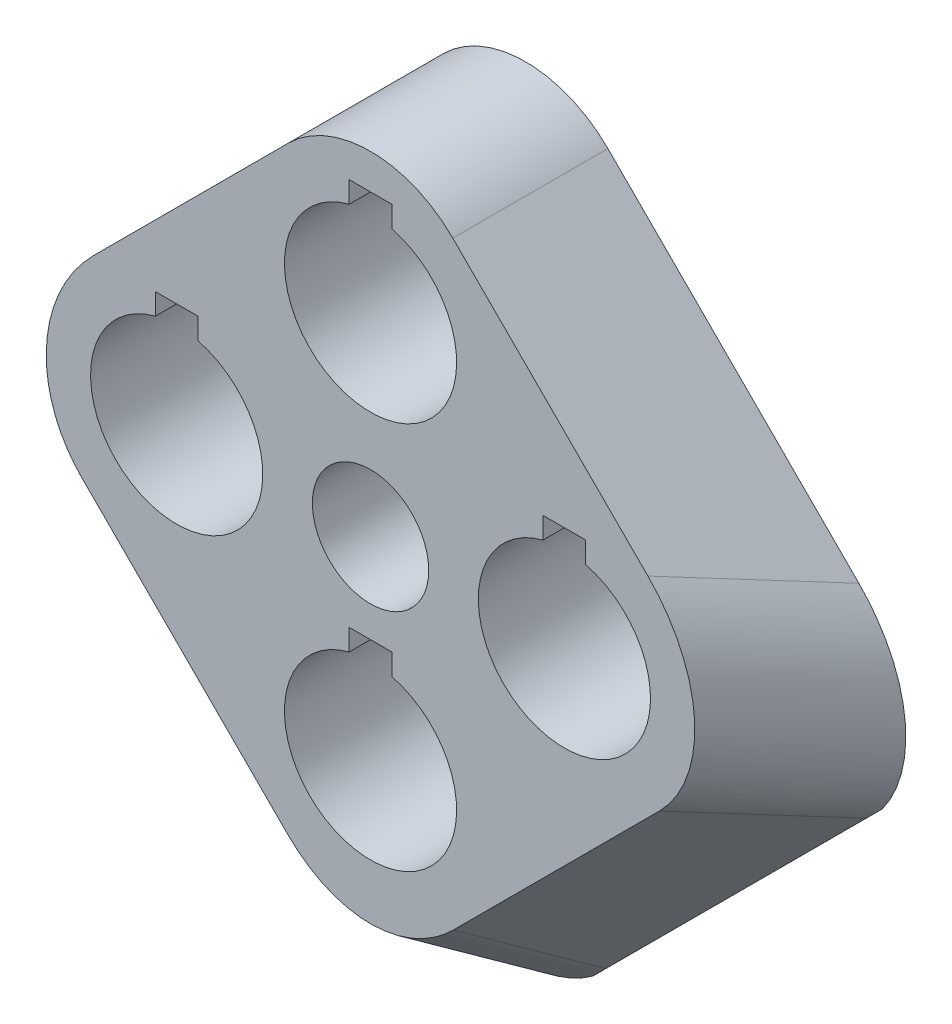
ISO-10303-21;
HEADER;
FILE_DESCRIPTION(('STEP AP214'),'2;1');
FILE_NAME('part.step','',(''),(''),'','','');
FILE_SCHEMA(('AUTOMOTIVE_DESIGN { 1 0 10303 214 1 1 1 1 }'));
ENDSEC;
DATA;
#1=APPLICATION_CONTEXT('core data for automotive mechanical design processes');
#2=APPLICATION_PROTOCOL_DEFINITION('international standard','automotive_design',2000,#1);
#3=PRODUCT_CONTEXT('',#1,'mechanical');
#4=PRODUCT('Part','Part','',(#3));
#5=PRODUCT_RELATED_PRODUCT_CATEGORY('part','',(#4));
#6=PRODUCT_DEFINITION_FORMATION('','',#4);
#7=PRODUCT_DEFINITION_CONTEXT('part definition',#1,'design');
#8=PRODUCT_DEFINITION('design','',#6,#7);
#9=PRODUCT_DEFINITION_SHAPE('','',#8);
#10=(LENGTH_UNIT() NAMED_UNIT(*) SI_UNIT(.MILLI.,.METRE.));
#11=(NAMED_UNIT(*) PLANE_ANGLE_UNIT() SI_UNIT($,.RADIAN.));
#12=(NAMED_UNIT(*) SI_UNIT($,.STERADIAN.) SOLID_ANGLE_UNIT());
#13=UNCERTAINTY_MEASURE_WITH_UNIT(LENGTH_MEASURE(1.E-05),#10,'distance_accuracy_value','');
#14=(GEOMETRIC_REPRESENTATION_CONTEXT(3) GLOBAL_UNCERTAINTY_ASSIGNED_CONTEXT((#13)) GLOBAL_UNIT_ASSIGNED_CONTEXT((#10,
#11,#12)) REPRESENTATION_CONTEXT('',''));
#15=CARTESIAN_POINT('',(0.,0.,0.));
#16=DIRECTION('',(0.,0.,1.));
#17=DIRECTION('',(1.,0.,0.));
#18=AXIS2_PLACEMENT_3D('',#15,#16,#17);
#19=CARTESIAN_POINT('',(0.,0.,20.));
#20=DIRECTION('',(0.,0.,1.));
#21=DIRECTION('',(1.,0.,0.));
#22=AXIS2_PLACEMENT_3D('',#19,#20,#21);
#23=PLANE('',#22);
#24=DIRECTION('',(0.707106781186547,-0.707106781186548,0.));
#25=VECTOR('',#24,1.);
#26=CARTESIAN_POINT('',(-12.1276695296628,-12.1276695296628,20.));
#27=LINE('',#26,#25);
#28=CARTESIAN_POINT('',(-37.2345237791552,12.9791847198296,20.));
#29=VERTEX_POINT('',#28);
#30=CARTESIAN_POINT('',(-10.7106248406957,-13.5447142186299,20.));
#31=VERTEX_POINT('',#30);
#32=EDGE_CURVE('E377',#29,#31,#27,.T.);
#33=ORIENTED_EDGE('',*,*,#32,.T.);
#34=CARTESIAN_POINT('',(1.84926216038584E-13,2.72721371405883,20.));
#35=DIRECTION('',(0.,0.,1.));
#36=DIRECTION('',(0.,1.,0.));
#37=AXIS2_PLACEMENT_3D('',#34,#35,#36);
#38=ELLIPSE('',#37,20.9537145673144,17.);
#39=CARTESIAN_POINT('',(10.7106248406959,-13.54471421863,20.));
#40=VERTEX_POINT('',#39);
#41=EDGE_CURVE('E392',#31,#40,#38,.T.);
#42=ORIENTED_EDGE('',*,*,#41,.T.);
#43=DIRECTION('',(0.707106781186554,0.707106781186541,0.));
#44=VECTOR('',#43,1.);
#45=CARTESIAN_POINT('',(12.1276695296629,-12.1276695296631,20.));
#46=LINE('',#45,#44);
#47=CARTESIAN_POINT('',(37.2345237791555,12.9791847198291,20.));
#48=VERTEX_POINT('',#47);
#49=EDGE_CURVE('E374',#40,#48,#46,.T.);
#50=ORIENTED_EDGE('',*,*,#49,.T.);
#51=CARTESIAN_POINT('',(23.7432473924633,26.4704611065215,20.));
#52=DIRECTION('',(0.,0.,1.));
#53=DIRECTION('',(0.707106781186548,-0.707106781186548,0.));
#54=AXIS2_PLACEMENT_3D('',#51,#52,#53);
#55=ELLIPSE('',#54,19.0795460397841,17.);
#56=CARTESIAN_POINT('',(35.7640626726346,38.4912763866928,20.));
#57=VERTEX_POINT('',#56);
#58=EDGE_CURVE('E390',#48,#57,#55,.T.);
#59=ORIENTED_EDGE('',*,*,#58,.T.);
#60=DIRECTION('',(-0.707106781186547,0.707106781186547,0.));
#61=VECTOR('',#60,1.);
#62=CARTESIAN_POINT('',(0.,74.2553390593274,20.));
#63=LINE('',#62,#61);
#64=CARTESIAN_POINT('',(10.6066017177982,63.6487373415292,20.));
#65=VERTEX_POINT('',#64);
#66=EDGE_CURVE('E352',#57,#65,#63,.T.);
#67=ORIENTED_EDGE('',*,*,#66,.T.);
#68=CARTESIAN_POINT('',(0.,53.0421356237309,20.));
#69=DIRECTION('',(0.,0.,1.));
#70=DIRECTION('',(1.,0.,0.));
#71=AXIS2_PLACEMENT_3D('',#68,#69,#70);
#72=CIRCLE('',#71,15.);
#73=CARTESIAN_POINT('',(-10.6066017177982,63.6487373415292,20.));
#74=VERTEX_POINT('',#73);
#75=EDGE_CURVE('E369',#65,#74,#72,.T.);
#76=ORIENTED_EDGE('',*,*,#75,.T.);
#77=DIRECTION('',(-0.707106781186548,-0.707106781186548,0.));
#78=VECTOR('',#77,1.);
#79=CARTESIAN_POINT('',(0.,74.2553390593274,20.));
#80=LINE('',#79,#78);
#81=CARTESIAN_POINT('',(-35.7640626726342,38.4912763866932,20.));
#82=VERTEX_POINT('',#81);
#83=EDGE_CURVE('E354',#74,#82,#80,.T.);
#84=ORIENTED_EDGE('',*,*,#83,.T.);
#85=CARTESIAN_POINT('',(-23.7432473924629,26.4704611065219,20.));
#86=DIRECTION('',(0.,0.,1.));
#87=DIRECTION('',(0.707106781186548,0.707106781186548,0.));
#88=AXIS2_PLACEMENT_3D('',#85,#86,#87);
#89=ELLIPSE('',#88,19.0795460397841,17.);
#90=EDGE_CURVE('E388',#82,#29,#89,.T.);
#91=ORIENTED_EDGE('',*,*,#90,.T.);
#92=EDGE_LOOP('',(#33,#42,#50,#59,#67,#76,#84,#91));
#93=FACE_BOUND('',#92,.T.);
#94=DIRECTION('',(0.,1.,0.));
#95=VECTOR('',#94,1.);
#96=CARTESIAN_POINT('',(27.75,38.5039527616593,20.));
#97=LINE('',#96,#95);
#98=CARTESIAN_POINT('',(27.75,35.7539527616593,20.));
#99=VERTEX_POINT('',#98);
#100=CARTESIAN_POINT('',(27.75,38.5039527616593,20.));
#101=VERTEX_POINT('',#100);
#102=EDGE_CURVE('E255',#99,#101,#97,.T.);
#103=ORIENTED_EDGE('',*,*,#102,.F.);
#104=CARTESIAN_POINT('',(25.,25.,20.));
#105=DIRECTION('',(0.,0.,1.));
#106=DIRECTION('',(1.,0.,0.));
#107=AXIS2_PLACEMENT_3D('',#104,#105,#106);
#108=CIRCLE('',#107,11.1);
#109=CARTESIAN_POINT('',(22.25,35.7539527616593,20.));
#110=VERTEX_POINT('',#109);
#111=EDGE_CURVE('E253',#110,#99,#108,.T.);
#112=ORIENTED_EDGE('',*,*,#111,.F.);
#113=DIRECTION('',(0.,-1.,0.));
#114=VECTOR('',#113,1.);
#115=CARTESIAN_POINT('',(22.25,38.5039527616593,20.));
#116=LINE('',#115,#114);
#117=CARTESIAN_POINT('',(22.25,38.5039527616593,20.));
#118=VERTEX_POINT('',#117);
#119=EDGE_CURVE('E261',#118,#110,#116,.T.);
#120=ORIENTED_EDGE('',*,*,#119,.F.);
#121=DIRECTION('',(-1.,0.,0.));
#122=VECTOR('',#121,1.);
#123=CARTESIAN_POINT('',(22.25,38.5039527616593,20.));
#124=LINE('',#123,#122);
#125=EDGE_CURVE('E258',#101,#118,#124,.T.);
#126=ORIENTED_EDGE('',*,*,#125,.F.);
#127=EDGE_LOOP('',(#103,#112,#120,#126));
#128=FACE_BOUND('',#127,.T.);
#129=DIRECTION('',(0.,1.,0.));
#130=VECTOR('',#129,1.);
#131=CARTESIAN_POINT('',(2.75,63.5039527616593,20.));
#132=LINE('',#131,#130);
#133=CARTESIAN_POINT('',(2.75,60.7539527616593,20.));
#134=VERTEX_POINT('',#133);
#135=CARTESIAN_POINT('',(2.75,63.5039527616593,20.));
#136=VERTEX_POINT('',#135);
#137=EDGE_CURVE('E292',#134,#136,#132,.T.);
#138=ORIENTED_EDGE('',*,*,#137,.F.);
#139=CARTESIAN_POINT('',(0.,50.,20.));
#140=DIRECTION('',(0.,0.,1.));
#141=DIRECTION('',(1.,0.,0.));
#142=AXIS2_PLACEMENT_3D('',#139,#140,#141);
#143=CIRCLE('',#142,11.1);
#144=CARTESIAN_POINT('',(-2.75,60.7539527616593,20.));
#145=VERTEX_POINT('',#144);
#146=EDGE_CURVE('E290',#145,#134,#143,.T.);
#147=ORIENTED_EDGE('',*,*,#146,.F.);
#148=DIRECTION('',(0.,-1.,0.));
#149=VECTOR('',#148,1.);
#150=CARTESIAN_POINT('',(-2.75,63.5039527616593,20.));
#151=LINE('',#150,#149);
#152=CARTESIAN_POINT('',(-2.75,63.5039527616593,20.));
#153=VERTEX_POINT('',#152);
#154=EDGE_CURVE('E298',#153,#145,#151,.T.);
#155=ORIENTED_EDGE('',*,*,#154,.F.);
#156=DIRECTION('',(-1.,0.,0.));
#157=VECTOR('',#156,1.);
#158=CARTESIAN_POINT('',(-2.75,63.5039527616593,20.));
#159=LINE('',#158,#157);
#160=EDGE_CURVE('E295',#136,#153,#159,.T.);
#161=ORIENTED_EDGE('',*,*,#160,.F.);
#162=EDGE_LOOP('',(#138,#147,#155,#161));
#163=FACE_BOUND('',#162,.T.);
#164=DIRECTION('',(0.,1.,0.));
#165=VECTOR('',#164,1.);
#166=CARTESIAN_POINT('',(2.75,13.5039527616593,20.));
#167=LINE('',#166,#165);
#168=CARTESIAN_POINT('',(2.75,10.7539527616593,20.));
#169=VERTEX_POINT('',#168);
#170=CARTESIAN_POINT('',(2.75,13.5039527616593,20.));
#171=VERTEX_POINT('',#170);
#172=EDGE_CURVE('E323',#169,#171,#167,.T.);
#173=ORIENTED_EDGE('',*,*,#172,.F.);
#174=CARTESIAN_POINT('',(0.,0.,20.));
#175=DIRECTION('',(0.,0.,1.));
#176=DIRECTION('',(1.,0.,0.));
#177=AXIS2_PLACEMENT_3D('',#174,#175,#176);
#178=CIRCLE('',#177,11.1);
#179=CARTESIAN_POINT('',(-2.75,10.7539527616593,20.));
#180=VERTEX_POINT('',#179);
#181=EDGE_CURVE('E321',#180,#169,#178,.T.);
#182=ORIENTED_EDGE('',*,*,#181,.F.);
#183=DIRECTION('',(0.,-1.,0.));
#184=VECTOR('',#183,1.);
#185=CARTESIAN_POINT('',(-2.75,13.5039527616593,20.));
#186=LINE('',#185,#184);
#187=CARTESIAN_POINT('',(-2.75,13.5039527616593,20.));
#188=VERTEX_POINT('',#187);
#189=EDGE_CURVE('E329',#188,#180,#186,.T.);
#190=ORIENTED_EDGE('',*,*,#189,.F.);
#191=DIRECTION('',(-1.,0.,0.));
#192=VECTOR('',#191,1.);
#193=CARTESIAN_POINT('',(-2.75,13.5039527616593,20.));
#194=LINE('',#193,#192);
#195=EDGE_CURVE('E326',#171,#188,#194,.T.);
#196=ORIENTED_EDGE('',*,*,#195,.F.);
#197=EDGE_LOOP('',(#173,#182,#190,#196));
#198=FACE_BOUND('',#197,.T.);
#199=CARTESIAN_POINT('',(0.,25.,20.));
#200=DIRECTION('',(0.,0.,1.));
#201=DIRECTION('',(1.,0.,0.));
#202=AXIS2_PLACEMENT_3D('',#199,#200,#201);
#203=CIRCLE('',#202,7.5);
#204=CARTESIAN_POINT('',(7.5,25.,20.));
#205=VERTEX_POINT('',#204);
#206=EDGE_CURVE('E284',#205,#205,#203,.T.);
#207=ORIENTED_EDGE('',*,*,#206,.F.);
#208=EDGE_LOOP('',(#207));
#209=FACE_BOUND('',#208,.T.);
#210=DIRECTION('',(0.,1.,0.));
#211=VECTOR('',#210,1.);
#212=CARTESIAN_POINT('',(-22.25,38.5039527616593,20.));
#213=LINE('',#212,#211);
#214=CARTESIAN_POINT('',(-22.25,35.7539527616593,20.));
#215=VERTEX_POINT('',#214);
#216=CARTESIAN_POINT('',(-22.25,38.5039527616593,20.));
#217=VERTEX_POINT('',#216);
#218=EDGE_CURVE('E220',#215,#217,#213,.T.);
#219=ORIENTED_EDGE('',*,*,#218,.F.);
#220=CARTESIAN_POINT('',(-25.,25.,20.));
#221=DIRECTION('',(0.,0.,1.));
#222=DIRECTION('',(1.,0.,0.));
#223=AXIS2_PLACEMENT_3D('',#220,#221,#222);
#224=CIRCLE('',#223,11.1);
#225=CARTESIAN_POINT('',(-27.75,35.7539527616593,20.));
#226=VERTEX_POINT('',#225);
#227=EDGE_CURVE('E210',#226,#215,#224,.T.);
#228=ORIENTED_EDGE('',*,*,#227,.F.);
#229=DIRECTION('',(0.,-1.,0.));
#230=VECTOR('',#229,1.);
#231=CARTESIAN_POINT('',(-27.75,38.5039527616593,20.));
#232=LINE('',#231,#230);
#233=CARTESIAN_POINT('',(-27.75,38.5039527616593,20.));
#234=VERTEX_POINT('',#233);
#235=EDGE_CURVE('E235',#234,#226,#232,.T.);
#236=ORIENTED_EDGE('',*,*,#235,.F.);
#237=DIRECTION('',(-1.,0.,0.));
#238=VECTOR('',#237,1.);
#239=CARTESIAN_POINT('',(-27.75,38.5039527616593,20.));
#240=LINE('',#239,#238);
#241=EDGE_CURVE('E233',#217,#234,#240,.T.);
#242=ORIENTED_EDGE('',*,*,#241,.F.);
#243=EDGE_LOOP('',(#219,#228,#236,#242));
#244=FACE_BOUND('',#243,.T.);
#245=ADVANCED_FACE('F33',(#93,#128,#163,#198,#209,#244),#23,.T.);
#246=CARTESIAN_POINT('',(0.,0.,0.));
#247=DIRECTION('',(0.,0.,1.));
#248=DIRECTION('',(1.,0.,0.));
#249=AXIS2_PLACEMENT_3D('',#246,#247,#248);
#250=PLANE('',#249);
#251=DIRECTION('',(-0.707106781186554,-0.707106781186541,0.));
#252=VECTOR('',#251,1.);
#253=CARTESIAN_POINT('',(56.3264068711923,17.9289321881347,0.));
#254=LINE('',#253,#252);
#255=CARTESIAN_POINT('',(46.0000691384833,7.60259445542586,0.));
#256=VERTEX_POINT('',#255);
#257=CARTESIAN_POINT('',(8.74275468742108,-29.6547199956357,0.));
#258=VERTEX_POINT('',#257);
#259=EDGE_CURVE('E451',#256,#258,#254,.T.);
#260=ORIENTED_EDGE('',*,*,#259,.T.);
#261=CARTESIAN_POINT('',(1.20079914221735E-13,-11.6843423069265,0.));
#262=DIRECTION('',(0.,0.,1.));
#263=DIRECTION('',(0.,1.,0.));
#264=AXIS2_PLACEMENT_3D('',#261,#262,#263);
#265=ELLIPSE('',#264,20.9537145673144,17.);
#266=CARTESIAN_POINT('',(-8.74275468742102,-29.6547199956356,0.));
#267=VERTEX_POINT('',#266);
#268=EDGE_CURVE('E404',#258,#267,#265,.F.);
#269=ORIENTED_EDGE('',*,*,#268,.T.);
#270=DIRECTION('',(-0.707106781186547,0.707106781186548,0.));
#271=VECTOR('',#270,1.);
#272=CARTESIAN_POINT('',(0.,-38.3974746830566,0.));
#273=LINE('',#272,#271);
#274=CARTESIAN_POINT('',(-46.0000691384829,7.60259445542632,0.));
#275=VERTEX_POINT('',#274);
#276=EDGE_CURVE('E242',#267,#275,#273,.T.);
#277=ORIENTED_EDGE('',*,*,#276,.T.);
#278=CARTESIAN_POINT('',(-30.9490254029556,19.2646830960292,0.));
#279=DIRECTION('',(0.,0.,1.));
#280=DIRECTION('',(0.707106781186548,0.707106781186548,0.));
#281=AXIS2_PLACEMENT_3D('',#278,#279,#280);
#282=ELLIPSE('',#281,19.0795460397841,17.);
#283=CARTESIAN_POINT('',(-42.9698406831269,31.2854983762005,0.));
#284=VERTEX_POINT('',#283);
#285=EDGE_CURVE('E56',#275,#284,#282,.F.);
#286=ORIENTED_EDGE('',*,*,#285,.T.);
#287=DIRECTION('',(-0.707106781186548,-0.707106781186548,0.));
#288=VECTOR('',#287,1.);
#289=CARTESIAN_POINT('',(0.,74.2553390593274,0.));
#290=LINE('',#289,#288);
#291=CARTESIAN_POINT('',(-10.6066017177982,63.6487373415292,0.));
#292=VERTEX_POINT('',#291);
#293=EDGE_CURVE('E355',#292,#284,#290,.T.);
#294=ORIENTED_EDGE('',*,*,#293,.F.);
#295=CARTESIAN_POINT('',(0.,53.0421356237309,0.));
#296=DIRECTION('',(0.,0.,1.));
#297=DIRECTION('',(1.,0.,0.));
#298=AXIS2_PLACEMENT_3D('',#295,#296,#297);
#299=CIRCLE('',#298,15.);
#300=CARTESIAN_POINT('',(10.6066017177982,63.6487373415292,0.));
#301=VERTEX_POINT('',#300);
#302=EDGE_CURVE('E363',#292,#301,#299,.F.);
#303=ORIENTED_EDGE('',*,*,#302,.T.);
#304=DIRECTION('',(-0.707106781186547,0.707106781186547,0.));
#305=VECTOR('',#304,1.);
#306=CARTESIAN_POINT('',(0.,74.2553390593274,0.));
#307=LINE('',#306,#305);
#308=CARTESIAN_POINT('',(42.9698406831273,31.2854983762001,0.));
#309=VERTEX_POINT('',#308);
#310=EDGE_CURVE('E351',#309,#301,#307,.T.);
#311=ORIENTED_EDGE('',*,*,#310,.F.);
#312=CARTESIAN_POINT('',(30.949025402956,19.2646830960288,0.));
#313=DIRECTION('',(0.,0.,1.));
#314=DIRECTION('',(0.707106781186548,-0.707106781186548,0.));
#315=AXIS2_PLACEMENT_3D('',#312,#313,#314);
#316=ELLIPSE('',#315,19.0795460397841,17.);
#317=EDGE_CURVE('E48',#309,#256,#316,.F.);
#318=ORIENTED_EDGE('',*,*,#317,.T.);
#319=EDGE_LOOP('',(#260,#269,#277,#286,#294,#303,#311,#318));
#320=FACE_BOUND('',#319,.T.);
#321=CARTESIAN_POINT('',(25.,25.,0.));
#322=DIRECTION('',(0.,0.,1.));
#323=DIRECTION('',(1.,0.,0.));
#324=AXIS2_PLACEMENT_3D('',#321,#322,#323);
#325=CIRCLE('',#324,11.1);
#326=CARTESIAN_POINT('',(22.25,35.7539527616593,0.));
#327=VERTEX_POINT('',#326);
#328=CARTESIAN_POINT('',(27.75,35.7539527616593,0.));
#329=VERTEX_POINT('',#328);
#330=EDGE_CURVE('E228',#327,#329,#325,.T.);
#331=ORIENTED_EDGE('',*,*,#330,.T.);
#332=DIRECTION('',(0.,1.,0.));
#333=VECTOR('',#332,1.);
#334=CARTESIAN_POINT('',(27.75,38.5039527616593,0.));
#335=LINE('',#334,#333);
#336=CARTESIAN_POINT('',(27.75,38.5039527616593,0.));
#337=VERTEX_POINT('',#336);
#338=EDGE_CURVE('E266',#329,#337,#335,.T.);
#339=ORIENTED_EDGE('',*,*,#338,.T.);
#340=DIRECTION('',(-1.,0.,0.));
#341=VECTOR('',#340,1.);
#342=CARTESIAN_POINT('',(22.25,38.5039527616593,0.));
#343=LINE('',#342,#341);
#344=CARTESIAN_POINT('',(22.25,38.5039527616593,0.));
#345=VERTEX_POINT('',#344);
#346=EDGE_CURVE('E269',#337,#345,#343,.T.);
#347=ORIENTED_EDGE('',*,*,#346,.T.);
#348=DIRECTION('',(0.,-1.,0.));
#349=VECTOR('',#348,1.);
#350=CARTESIAN_POINT('',(22.25,38.5039527616593,0.));
#351=LINE('',#350,#349);
#352=EDGE_CURVE('E256',#345,#327,#351,.T.);
#353=ORIENTED_EDGE('',*,*,#352,.T.);
#354=EDGE_LOOP('',(#331,#339,#347,#353));
#355=FACE_BOUND('',#354,.T.);
#356=CARTESIAN_POINT('',(0.,50.,0.));
#357=DIRECTION('',(0.,0.,1.));
#358=DIRECTION('',(1.,0.,0.));
#359=AXIS2_PLACEMENT_3D('',#356,#357,#358);
#360=CIRCLE('',#359,11.1);
#361=CARTESIAN_POINT('',(-2.75,60.7539527616593,0.));
#362=VERTEX_POINT('',#361);
#363=CARTESIAN_POINT('',(2.75,60.7539527616593,0.));
#364=VERTEX_POINT('',#363);
#365=EDGE_CURVE('E287',#362,#364,#360,.T.);
#366=ORIENTED_EDGE('',*,*,#365,.T.);
#367=DIRECTION('',(0.,1.,0.));
#368=VECTOR('',#367,1.);
#369=CARTESIAN_POINT('',(2.75,63.5039527616593,0.));
#370=LINE('',#369,#368);
#371=CARTESIAN_POINT('',(2.75,63.5039527616593,0.));
#372=VERTEX_POINT('',#371);
#373=EDGE_CURVE('E303',#364,#372,#370,.T.);
#374=ORIENTED_EDGE('',*,*,#373,.T.);
#375=DIRECTION('',(-1.,0.,0.));
#376=VECTOR('',#375,1.);
#377=CARTESIAN_POINT('',(-2.75,63.5039527616593,0.));
#378=LINE('',#377,#376);
#379=CARTESIAN_POINT('',(-2.75,63.5039527616593,0.));
#380=VERTEX_POINT('',#379);
#381=EDGE_CURVE('E306',#372,#380,#378,.T.);
#382=ORIENTED_EDGE('',*,*,#381,.T.);
#383=DIRECTION('',(0.,-1.,0.));
#384=VECTOR('',#383,1.);
#385=CARTESIAN_POINT('',(-2.75,63.5039527616593,0.));
#386=LINE('',#385,#384);
#387=EDGE_CURVE('E293',#380,#362,#386,.T.);
#388=ORIENTED_EDGE('',*,*,#387,.T.);
#389=EDGE_LOOP('',(#366,#374,#382,#388));
#390=FACE_BOUND('',#389,.T.);
#391=CARTESIAN_POINT('',(0.,0.,0.));
#392=DIRECTION('',(0.,0.,1.));
#393=DIRECTION('',(1.,0.,0.));
#394=AXIS2_PLACEMENT_3D('',#391,#392,#393);
#395=CIRCLE('',#394,11.1);
#396=CARTESIAN_POINT('',(-2.75,10.7539527616593,0.));
#397=VERTEX_POINT('',#396);
#398=CARTESIAN_POINT('',(2.75,10.7539527616593,0.));
#399=VERTEX_POINT('',#398);
#400=EDGE_CURVE('E320',#397,#399,#395,.T.);
#401=ORIENTED_EDGE('',*,*,#400,.T.);
#402=DIRECTION('',(0.,1.,0.));
#403=VECTOR('',#402,1.);
#404=CARTESIAN_POINT('',(2.75,13.5039527616593,0.));
#405=LINE('',#404,#403);
#406=CARTESIAN_POINT('',(2.75,13.5039527616593,0.));
#407=VERTEX_POINT('',#406);
#408=EDGE_CURVE('E334',#399,#407,#405,.T.);
#409=ORIENTED_EDGE('',*,*,#408,.T.);
#410=DIRECTION('',(-1.,0.,0.));
#411=VECTOR('',#410,1.);
#412=CARTESIAN_POINT('',(-2.75,13.5039527616593,0.));
#413=LINE('',#412,#411);
#414=CARTESIAN_POINT('',(-2.75,13.5039527616593,0.));
#415=VERTEX_POINT('',#414);
#416=EDGE_CURVE('E337',#407,#415,#413,.T.);
#417=ORIENTED_EDGE('',*,*,#416,.T.);
#418=DIRECTION('',(0.,-1.,0.));
#419=VECTOR('',#418,1.);
#420=CARTESIAN_POINT('',(-2.75,13.5039527616593,0.));
#421=LINE('',#420,#419);
#422=EDGE_CURVE('E324',#415,#397,#421,.T.);
#423=ORIENTED_EDGE('',*,*,#422,.T.);
#424=EDGE_LOOP('',(#401,#409,#417,#423));
#425=FACE_BOUND('',#424,.T.);
#426=CARTESIAN_POINT('',(0.,25.,0.));
#427=DIRECTION('',(0.,0.,1.));
#428=DIRECTION('',(1.,0.,0.));
#429=AXIS2_PLACEMENT_3D('',#426,#427,#428);
#430=CIRCLE('',#429,7.5);
#431=CARTESIAN_POINT('',(7.5,25.,0.));
#432=VERTEX_POINT('',#431);
#433=EDGE_CURVE('E283',#432,#432,#430,.T.);
#434=ORIENTED_EDGE('',*,*,#433,.T.);
#435=EDGE_LOOP('',(#434));
#436=FACE_BOUND('',#435,.T.);
#437=CARTESIAN_POINT('',(-25.,25.,0.));
#438=DIRECTION('',(0.,0.,1.));
#439=DIRECTION('',(1.,0.,0.));
#440=AXIS2_PLACEMENT_3D('',#437,#438,#439);
#441=CIRCLE('',#440,11.1);
#442=CARTESIAN_POINT('',(-27.75,35.7539527616593,0.));
#443=VERTEX_POINT('',#442);
#444=CARTESIAN_POINT('',(-22.25,35.7539527616593,0.));
#445=VERTEX_POINT('',#444);
#446=EDGE_CURVE('E240',#443,#445,#441,.T.);
#447=ORIENTED_EDGE('',*,*,#446,.T.);
#448=DIRECTION('',(0.,1.,0.));
#449=VECTOR('',#448,1.);
#450=CARTESIAN_POINT('',(-22.25,38.5039527616593,0.));
#451=LINE('',#450,#449);
#452=CARTESIAN_POINT('',(-22.25,38.5039527616593,0.));
#453=VERTEX_POINT('',#452);
#454=EDGE_CURVE('E227',#445,#453,#451,.T.);
#455=ORIENTED_EDGE('',*,*,#454,.T.);
#456=DIRECTION('',(-1.,0.,0.));
#457=VECTOR('',#456,1.);
#458=CARTESIAN_POINT('',(-27.75,38.5039527616593,0.));
#459=LINE('',#458,#457);
#460=CARTESIAN_POINT('',(-27.75,38.5039527616593,0.));
#461=VERTEX_POINT('',#460);
#462=EDGE_CURVE('E244',#453,#461,#459,.T.);
#463=ORIENTED_EDGE('',*,*,#462,.T.);
#464=DIRECTION('',(0.,-1.,0.));
#465=VECTOR('',#464,1.);
#466=CARTESIAN_POINT('',(-27.75,38.5039527616593,0.));
#467=LINE('',#466,#465);
#468=EDGE_CURVE('E221',#461,#443,#467,.T.);
#469=ORIENTED_EDGE('',*,*,#468,.T.);
#470=EDGE_LOOP('',(#447,#455,#463,#469));
#471=FACE_BOUND('',#470,.T.);
#472=ADVANCED_FACE('F415',(#320,#355,#390,#425,#436,#471),#250,.F.);
#473=CARTESIAN_POINT('',(0.,74.2553390593274,20.));
#474=DIRECTION('',(-0.707106781186548,-0.707106781186548,0.));
#475=DIRECTION('',(0.707106781186548,-0.707106781186548,0.));
#476=AXIS2_PLACEMENT_3D('',#473,#474,#475);
#477=PLANE('',#476);
#478=ORIENTED_EDGE('',*,*,#66,.F.);
#479=DIRECTION('',(-0.321019760960104,0.321019760960104,0.891006524188367));
#480=VECTOR('',#479,1.);
#481=CARTESIAN_POINT('',(45.6157820304965,28.6395570288308,-7.34394355062386));
#482=LINE('',#481,#480);
#483=EDGE_CURVE('E41',#57,#309,#482,.F.);
#484=ORIENTED_EDGE('',*,*,#483,.T.);
#485=ORIENTED_EDGE('',*,*,#310,.T.);
#486=DIRECTION('',(0.,0.,-1.));
#487=VECTOR('',#486,1.);
#488=CARTESIAN_POINT('',(10.6066017177982,63.6487373415292,20.));
#489=LINE('',#488,#487);
#490=EDGE_CURVE('E366',#301,#65,#489,.F.);
#491=ORIENTED_EDGE('',*,*,#490,.T.);
#492=EDGE_LOOP('',(#478,#484,#485,#491));
#493=FACE_BOUND('',#492,.T.);
#494=ADVANCED_FACE('F412',(#493),#477,.F.);
#495=CARTESIAN_POINT('',(0.,74.2553390593274,20.));
#496=DIRECTION('',(0.707106781186548,-0.707106781186548,0.));
#497=DIRECTION('',(0.707106781186548,0.707106781186548,0.));
#498=AXIS2_PLACEMENT_3D('',#495,#496,#497);
#499=PLANE('',#498);
#500=ORIENTED_EDGE('',*,*,#293,.T.);
#501=DIRECTION('',(-0.321019760960104,-0.321019760960104,-0.891006524188367));
#502=VECTOR('',#501,1.);
#503=CARTESIAN_POINT('',(-38.5447142186306,35.7106248406968,12.2821615044277));
#504=LINE('',#503,#502);
#505=EDGE_CURVE('E11',#284,#82,#504,.F.);
#506=ORIENTED_EDGE('',*,*,#505,.T.);
#507=ORIENTED_EDGE('',*,*,#83,.F.);
#508=DIRECTION('',(0.,0.,-1.));
#509=VECTOR('',#508,1.);
#510=CARTESIAN_POINT('',(-10.6066017177982,63.6487373415292,20.));
#511=LINE('',#510,#509);
#512=EDGE_CURVE('E358',#74,#292,#511,.T.);
#513=ORIENTED_EDGE('',*,*,#512,.T.);
#514=EDGE_LOOP('',(#500,#506,#507,#513));
#515=FACE_BOUND('',#514,.T.);
#516=ADVANCED_FACE('F427',(#515),#499,.F.);
#517=CARTESIAN_POINT('',(0.,0.,20.));
#518=DIRECTION('',(0.,0.,-1.));
#519=DIRECTION('',(-1.,0.,0.));
#520=AXIS2_PLACEMENT_3D('',#517,#518,#519);
#521=CYLINDRICAL_SURFACE('',#520,11.1);
#522=ORIENTED_EDGE('',*,*,#400,.F.);
#523=DIRECTION('',(0.,0.,-1.));
#524=VECTOR('',#523,1.);
#525=CARTESIAN_POINT('',(-2.75,10.7539527616593,20.));
#526=LINE('',#525,#524);
#527=EDGE_CURVE('E331',#180,#397,#526,.T.);
#528=ORIENTED_EDGE('',*,*,#527,.F.);
#529=ORIENTED_EDGE('',*,*,#181,.T.);
#530=DIRECTION('',(0.,0.,-1.));
#531=VECTOR('',#530,1.);
#532=CARTESIAN_POINT('',(2.75,10.7539527616593,20.));
#533=LINE('',#532,#531);
#534=EDGE_CURVE('E348',#169,#399,#533,.T.);
#535=ORIENTED_EDGE('',*,*,#534,.T.);
#536=EDGE_LOOP('',(#522,#528,#529,#535));
#537=FACE_BOUND('',#536,.T.);
#538=ADVANCED_FACE('F472',(#537),#521,.F.);
#539=CARTESIAN_POINT('',(2.75,13.5039527616593,20.));
#540=DIRECTION('',(-1.,0.,0.));
#541=DIRECTION('',(0.,0.,1.));
#542=AXIS2_PLACEMENT_3D('',#539,#540,#541);
#543=PLANE('',#542);
#544=ORIENTED_EDGE('',*,*,#408,.F.);
#545=ORIENTED_EDGE('',*,*,#534,.F.);
#546=ORIENTED_EDGE('',*,*,#172,.T.);
#547=DIRECTION('',(0.,0.,-1.));
#548=VECTOR('',#547,1.);
#549=CARTESIAN_POINT('',(2.75,13.5039527616593,20.));
#550=LINE('',#549,#548);
#551=EDGE_CURVE('E346',#171,#407,#550,.T.);
#552=ORIENTED_EDGE('',*,*,#551,.T.);
#553=EDGE_LOOP('',(#544,#545,#546,#552));
#554=FACE_BOUND('',#553,.T.);
#555=ADVANCED_FACE('F700',(#554),#543,.T.);
#556=CARTESIAN_POINT('',(-2.75,13.5039527616593,20.));
#557=DIRECTION('',(0.,-1.,0.));
#558=DIRECTION('',(0.,0.,-1.));
#559=AXIS2_PLACEMENT_3D('',#556,#557,#558);
#560=PLANE('',#559);
#561=ORIENTED_EDGE('',*,*,#416,.F.);
#562=ORIENTED_EDGE('',*,*,#551,.F.);
#563=ORIENTED_EDGE('',*,*,#195,.T.);
#564=DIRECTION('',(0.,0.,-1.));
#565=VECTOR('',#564,1.);
#566=CARTESIAN_POINT('',(-2.75,13.5039527616593,20.));
#567=LINE('',#566,#565);
#568=EDGE_CURVE('E344',#188,#415,#567,.T.);
#569=ORIENTED_EDGE('',*,*,#568,.T.);
#570=EDGE_LOOP('',(#561,#562,#563,#569));
#571=FACE_BOUND('',#570,.T.);
#572=ADVANCED_FACE('F690',(#571),#560,.T.);
#573=CARTESIAN_POINT('',(-2.75,13.5039527616593,20.));
#574=DIRECTION('',(1.,0.,0.));
#575=DIRECTION('',(0.,1.,0.));
#576=AXIS2_PLACEMENT_3D('',#573,#574,#575);
#577=PLANE('',#576);
#578=ORIENTED_EDGE('',*,*,#422,.F.);
#579=ORIENTED_EDGE('',*,*,#568,.F.);
#580=ORIENTED_EDGE('',*,*,#189,.T.);
#581=ORIENTED_EDGE('',*,*,#527,.T.);
#582=EDGE_LOOP('',(#578,#579,#580,#581));
#583=FACE_BOUND('',#582,.T.);
#584=ADVANCED_FACE('F680',(#583),#577,.T.);
#585=CARTESIAN_POINT('',(0.,50.,20.));
#586=DIRECTION('',(0.,0.,-1.));
#587=DIRECTION('',(-1.,0.,0.));
#588=AXIS2_PLACEMENT_3D('',#585,#586,#587);
#589=CYLINDRICAL_SURFACE('',#588,11.1);
#590=ORIENTED_EDGE('',*,*,#365,.F.);
#591=DIRECTION('',(0.,0.,-1.));
#592=VECTOR('',#591,1.);
#593=CARTESIAN_POINT('',(-2.75,60.7539527616593,20.));
#594=LINE('',#593,#592);
#595=EDGE_CURVE('E300',#145,#362,#594,.T.);
#596=ORIENTED_EDGE('',*,*,#595,.F.);
#597=ORIENTED_EDGE('',*,*,#146,.T.);
#598=DIRECTION('',(0.,0.,-1.));
#599=VECTOR('',#598,1.);
#600=CARTESIAN_POINT('',(2.75,60.7539527616593,20.));
#601=LINE('',#600,#599);
#602=EDGE_CURVE('E317',#134,#364,#601,.T.);
#603=ORIENTED_EDGE('',*,*,#602,.T.);
#604=EDGE_LOOP('',(#590,#596,#597,#603));
#605=FACE_BOUND('',#604,.T.);
#606=ADVANCED_FACE('F670',(#605),#589,.F.);
#607=CARTESIAN_POINT('',(2.75,63.5039527616593,20.));
#608=DIRECTION('',(-1.,0.,0.));
#609=DIRECTION('',(0.,0.,1.));
#610=AXIS2_PLACEMENT_3D('',#607,#608,#609);
#611=PLANE('',#610);
#612=ORIENTED_EDGE('',*,*,#373,.F.);
#613=ORIENTED_EDGE('',*,*,#602,.F.);
#614=ORIENTED_EDGE('',*,*,#137,.T.);
#615=DIRECTION('',(0.,0.,-1.));
#616=VECTOR('',#615,1.);
#617=CARTESIAN_POINT('',(2.75,63.5039527616593,20.));
#618=LINE('',#617,#616);
#619=EDGE_CURVE('E315',#136,#372,#618,.T.);
#620=ORIENTED_EDGE('',*,*,#619,.T.);
#621=EDGE_LOOP('',(#612,#613,#614,#620));
#622=FACE_BOUND('',#621,.T.);
#623=ADVANCED_FACE('F660',(#622),#611,.T.);
#624=CARTESIAN_POINT('',(-2.75,63.5039527616593,20.));
#625=DIRECTION('',(0.,-1.,0.));
#626=DIRECTION('',(0.,0.,-1.));
#627=AXIS2_PLACEMENT_3D('',#624,#625,#626);
#628=PLANE('',#627);
#629=ORIENTED_EDGE('',*,*,#381,.F.);
#630=ORIENTED_EDGE('',*,*,#619,.F.);
#631=ORIENTED_EDGE('',*,*,#160,.T.);
#632=DIRECTION('',(0.,0.,-1.));
#633=VECTOR('',#632,1.);
#634=CARTESIAN_POINT('',(-2.75,63.5039527616593,20.));
#635=LINE('',#634,#633);
#636=EDGE_CURVE('E313',#153,#380,#635,.T.);
#637=ORIENTED_EDGE('',*,*,#636,.T.);
#638=EDGE_LOOP('',(#629,#630,#631,#637));
#639=FACE_BOUND('',#638,.T.);
#640=ADVANCED_FACE('F650',(#639),#628,.T.);
#641=CARTESIAN_POINT('',(-2.75,63.5039527616593,20.));
#642=DIRECTION('',(1.,0.,0.));
#643=DIRECTION('',(0.,1.,0.));
#644=AXIS2_PLACEMENT_3D('',#641,#642,#643);
#645=PLANE('',#644);
#646=ORIENTED_EDGE('',*,*,#387,.F.);
#647=ORIENTED_EDGE('',*,*,#636,.F.);
#648=ORIENTED_EDGE('',*,*,#154,.T.);
#649=ORIENTED_EDGE('',*,*,#595,.T.);
#650=EDGE_LOOP('',(#646,#647,#648,#649));
#651=FACE_BOUND('',#650,.T.);
#652=ADVANCED_FACE('F640',(#651),#645,.T.);
#653=CARTESIAN_POINT('',(0.,25.,20.));
#654=DIRECTION('',(0.,0.,-1.));
#655=DIRECTION('',(-1.,0.,0.));
#656=AXIS2_PLACEMENT_3D('',#653,#654,#655);
#657=CYLINDRICAL_SURFACE('',#656,7.5);
#658=ORIENTED_EDGE('',*,*,#206,.T.);
#659=EDGE_LOOP('',(#658));
#660=FACE_BOUND('',#659,.T.);
#661=ORIENTED_EDGE('',*,*,#433,.F.);
#662=EDGE_LOOP('',(#661));
#663=FACE_BOUND('',#662,.T.);
#664=ADVANCED_FACE('F630',(#660,#663),#657,.F.);
#665=CARTESIAN_POINT('',(25.,25.,20.));
#666=DIRECTION('',(0.,0.,-1.));
#667=DIRECTION('',(-1.,0.,0.));
#668=AXIS2_PLACEMENT_3D('',#665,#666,#667);
#669=CYLINDRICAL_SURFACE('',#668,11.1);
#670=ORIENTED_EDGE('',*,*,#330,.F.);
#671=DIRECTION('',(0.,0.,-1.));
#672=VECTOR('',#671,1.);
#673=CARTESIAN_POINT('',(22.25,35.7539527616593,20.));
#674=LINE('',#673,#672);
#675=EDGE_CURVE('E263',#110,#327,#674,.T.);
#676=ORIENTED_EDGE('',*,*,#675,.F.);
#677=ORIENTED_EDGE('',*,*,#111,.T.);
#678=DIRECTION('',(0.,0.,-1.));
#679=VECTOR('',#678,1.);
#680=CARTESIAN_POINT('',(27.75,35.7539527616593,20.));
#681=LINE('',#680,#679);
#682=EDGE_CURVE('E280',#99,#329,#681,.T.);
#683=ORIENTED_EDGE('',*,*,#682,.T.);
#684=EDGE_LOOP('',(#670,#676,#677,#683));
#685=FACE_BOUND('',#684,.T.);
#686=ADVANCED_FACE('F620',(#685),#669,.F.);
#687=CARTESIAN_POINT('',(27.75,38.5039527616593,20.));
#688=DIRECTION('',(-1.,0.,0.));
#689=DIRECTION('',(0.,0.,1.));
#690=AXIS2_PLACEMENT_3D('',#687,#688,#689);
#691=PLANE('',#690);
#692=ORIENTED_EDGE('',*,*,#338,.F.);
#693=ORIENTED_EDGE('',*,*,#682,.F.);
#694=ORIENTED_EDGE('',*,*,#102,.T.);
#695=DIRECTION('',(0.,0.,-1.));
#696=VECTOR('',#695,1.);
#697=CARTESIAN_POINT('',(27.75,38.5039527616593,20.));
#698=LINE('',#697,#696);
#699=EDGE_CURVE('E278',#101,#337,#698,.T.);
#700=ORIENTED_EDGE('',*,*,#699,.T.);
#701=EDGE_LOOP('',(#692,#693,#694,#700));
#702=FACE_BOUND('',#701,.T.);
#703=ADVANCED_FACE('F610',(#702),#691,.T.);
#704=CARTESIAN_POINT('',(22.25,38.5039527616593,20.));
#705=DIRECTION('',(0.,-1.,0.));
#706=DIRECTION('',(0.,0.,-1.));
#707=AXIS2_PLACEMENT_3D('',#704,#705,#706);
#708=PLANE('',#707);
#709=ORIENTED_EDGE('',*,*,#346,.F.);
#710=ORIENTED_EDGE('',*,*,#699,.F.);
#711=ORIENTED_EDGE('',*,*,#125,.T.);
#712=DIRECTION('',(0.,0.,-1.));
#713=VECTOR('',#712,1.);
#714=CARTESIAN_POINT('',(22.25,38.5039527616593,20.));
#715=LINE('',#714,#713);
#716=EDGE_CURVE('E276',#118,#345,#715,.T.);
#717=ORIENTED_EDGE('',*,*,#716,.T.);
#718=EDGE_LOOP('',(#709,#710,#711,#717));
#719=FACE_BOUND('',#718,.T.);
#720=ADVANCED_FACE('F600',(#719),#708,.T.);
#721=CARTESIAN_POINT('',(22.25,38.5039527616593,20.));
#722=DIRECTION('',(1.,0.,0.));
#723=DIRECTION('',(0.,1.,0.));
#724=AXIS2_PLACEMENT_3D('',#721,#722,#723);
#725=PLANE('',#724);
#726=ORIENTED_EDGE('',*,*,#352,.F.);
#727=ORIENTED_EDGE('',*,*,#716,.F.);
#728=ORIENTED_EDGE('',*,*,#119,.T.);
#729=ORIENTED_EDGE('',*,*,#675,.T.);
#730=EDGE_LOOP('',(#726,#727,#728,#729));
#731=FACE_BOUND('',#730,.T.);
#732=ADVANCED_FACE('F591',(#731),#725,.T.);
#733=CARTESIAN_POINT('',(-25.,25.,20.));
#734=DIRECTION('',(0.,0.,-1.));
#735=DIRECTION('',(-1.,0.,0.));
#736=AXIS2_PLACEMENT_3D('',#733,#734,#735);
#737=CYLINDRICAL_SURFACE('',#736,11.1);
#738=ORIENTED_EDGE('',*,*,#446,.F.);
#739=DIRECTION('',(0.,0.,-1.));
#740=VECTOR('',#739,1.);
#741=CARTESIAN_POINT('',(-27.75,35.7539527616593,20.));
#742=LINE('',#741,#740);
#743=EDGE_CURVE('E216',#226,#443,#742,.T.);
#744=ORIENTED_EDGE('',*,*,#743,.F.);
#745=ORIENTED_EDGE('',*,*,#227,.T.);
#746=DIRECTION('',(0.,0.,-1.));
#747=VECTOR('',#746,1.);
#748=CARTESIAN_POINT('',(-22.25,35.7539527616593,20.));
#749=LINE('',#748,#747);
#750=EDGE_CURVE('E213',#215,#445,#749,.T.);
#751=ORIENTED_EDGE('',*,*,#750,.T.);
#752=EDGE_LOOP('',(#738,#744,#745,#751));
#753=FACE_BOUND('',#752,.T.);
#754=ADVANCED_FACE('F212',(#753),#737,.F.);
#755=CARTESIAN_POINT('',(-22.25,38.5039527616593,20.));
#756=DIRECTION('',(-1.,0.,0.));
#757=DIRECTION('',(0.,0.,1.));
#758=AXIS2_PLACEMENT_3D('',#755,#756,#757);
#759=PLANE('',#758);
#760=ORIENTED_EDGE('',*,*,#454,.F.);
#761=ORIENTED_EDGE('',*,*,#750,.F.);
#762=ORIENTED_EDGE('',*,*,#218,.T.);
#763=DIRECTION('',(0.,0.,-1.));
#764=VECTOR('',#763,1.);
#765=CARTESIAN_POINT('',(-22.25,38.5039527616593,20.));
#766=LINE('',#765,#764);
#767=EDGE_CURVE('E229',#217,#453,#766,.T.);
#768=ORIENTED_EDGE('',*,*,#767,.T.);
#769=EDGE_LOOP('',(#760,#761,#762,#768));
#770=FACE_BOUND('',#769,.T.);
#771=ADVANCED_FACE('F224',(#770),#759,.T.);
#772=CARTESIAN_POINT('',(-27.75,38.5039527616593,20.));
#773=DIRECTION('',(0.,-1.,0.));
#774=DIRECTION('',(0.,0.,-1.));
#775=AXIS2_PLACEMENT_3D('',#772,#773,#774);
#776=PLANE('',#775);
#777=ORIENTED_EDGE('',*,*,#462,.F.);
#778=ORIENTED_EDGE('',*,*,#767,.F.);
#779=ORIENTED_EDGE('',*,*,#241,.T.);
#780=DIRECTION('',(0.,0.,-1.));
#781=VECTOR('',#780,1.);
#782=CARTESIAN_POINT('',(-27.75,38.5039527616593,20.));
#783=LINE('',#782,#781);
#784=EDGE_CURVE('E250',#234,#461,#783,.T.);
#785=ORIENTED_EDGE('',*,*,#784,.T.);
#786=EDGE_LOOP('',(#777,#778,#779,#785));
#787=FACE_BOUND('',#786,.T.);
#788=ADVANCED_FACE('F564',(#787),#776,.T.);
#789=CARTESIAN_POINT('',(-27.75,38.5039527616593,20.));
#790=DIRECTION('',(1.,0.,0.));
#791=DIRECTION('',(0.,1.,0.));
#792=AXIS2_PLACEMENT_3D('',#789,#790,#791);
#793=PLANE('',#792);
#794=ORIENTED_EDGE('',*,*,#468,.F.);
#795=ORIENTED_EDGE('',*,*,#784,.F.);
#796=ORIENTED_EDGE('',*,*,#235,.T.);
#797=ORIENTED_EDGE('',*,*,#743,.T.);
#798=EDGE_LOOP('',(#794,#795,#796,#797));
#799=FACE_BOUND('',#798,.T.);
#800=ADVANCED_FACE('F463',(#799),#793,.T.);
#801=CARTESIAN_POINT('',(0.,53.0421356237309,20.));
#802=DIRECTION('',(0.,0.,-1.));
#803=DIRECTION('',(-1.,0.,0.));
#804=AXIS2_PLACEMENT_3D('',#801,#802,#803);
#805=CYLINDRICAL_SURFACE('',#804,15.);
#806=ORIENTED_EDGE('',*,*,#75,.F.);
#807=ORIENTED_EDGE('',*,*,#490,.F.);
#808=ORIENTED_EDGE('',*,*,#302,.F.);
#809=ORIENTED_EDGE('',*,*,#512,.F.);
#810=EDGE_LOOP('',(#806,#807,#808,#809));
#811=FACE_BOUND('',#810,.T.);
#812=ADVANCED_FACE('F422',(#811),#805,.T.);
#813=CARTESIAN_POINT('',(0.,-38.3974746830566,20.));
#814=DIRECTION('',(-0.707106781186548,-0.707106781186547,0.));
#815=DIRECTION('',(0.707106781186547,-0.707106781186548,0.));
#816=AXIS2_PLACEMENT_3D('',#813,#814,#815);
#817=PLANE('',#816);
#818=ORIENTED_EDGE('',*,*,#276,.F.);
#819=CARTESIAN_POINT('',(0.,-38.3974746830566,-37.0718225530009));
#820=DIRECTION('',(-0.707106781186548,-0.707106781186547,0.));
#821=DIRECTION('',(-0.321019760960102,0.321019760960102,0.891006524188369));
#822=AXIS2_PLACEMENT_3D('',#819,#820,#821);
#823=ELLIPSE('',#822,41.1239803391675,17.);
#824=CARTESIAN_POINT('',(-10.7106248406958,-27.6868498423608,0.373894944948505));
#825=VERTEX_POINT('',#824);
#826=EDGE_CURVE('E408',#267,#825,#823,.T.);
#827=ORIENTED_EDGE('',*,*,#826,.T.);
#828=DIRECTION('',(-0.707106781186547,0.707106781186548,0.));
#829=VECTOR('',#828,1.);
#830=CARTESIAN_POINT('',(0.,-38.3974746830566,0.373894944948505));
#831=LINE('',#830,#829);
#832=CARTESIAN_POINT('',(-44.3055915910207,5.9081169079641,0.373894944948505));
#833=VERTEX_POINT('',#832);
#834=EDGE_CURVE('E371',#825,#833,#831,.T.);
#835=ORIENTED_EDGE('',*,*,#834,.T.);
#836=CARTESIAN_POINT('',(-44.3055915910207,5.90811690796409,-37.0718225530009));
#837=DIRECTION('',(-0.707106781186548,-0.707106781186547,0.));
#838=DIRECTION('',(0.,0.,1.));
#839=AXIS2_PLACEMENT_3D('',#836,#837,#838);
#840=ELLIPSE('',#839,37.4457174979494,17.);
#841=EDGE_CURVE('E406',#833,#275,#840,.T.);
#842=ORIENTED_EDGE('',*,*,#841,.T.);
#843=EDGE_LOOP('',(#818,#827,#835,#842));
#844=FACE_BOUND('',#843,.T.);
#845=ADVANCED_FACE('F455',(#844),#817,.T.);
#846=CARTESIAN_POINT('',(56.3264068711923,17.9289321881347,20.));
#847=DIRECTION('',(0.707106781186541,-0.707106781186554,0.));
#848=DIRECTION('',(0.707106781186554,0.707106781186541,0.));
#849=AXIS2_PLACEMENT_3D('',#846,#847,#848);
#850=PLANE('',#849);
#851=DIRECTION('',(-0.707106781186554,-0.707106781186541,0.));
#852=VECTOR('',#851,1.);
#853=CARTESIAN_POINT('',(56.3264068711923,17.9289321881347,0.373894944948505));
#854=LINE('',#853,#852);
#855=CARTESIAN_POINT('',(44.305591591021,5.9081169079636,0.373894944948505));
#856=VERTEX_POINT('',#855);
#857=CARTESIAN_POINT('',(10.7106248406958,-27.6868498423609,0.373894944948505));
#858=VERTEX_POINT('',#857);
#859=EDGE_CURVE('E380',#856,#858,#854,.T.);
#860=ORIENTED_EDGE('',*,*,#859,.T.);
#861=CARTESIAN_POINT('',(0.,-38.3974746830566,-37.0718225530009));
#862=DIRECTION('',(0.707106781186541,-0.707106781186554,0.));
#863=DIRECTION('',(0.321019760960104,0.321019760960099,0.891006524188369));
#864=AXIS2_PLACEMENT_3D('',#861,#862,#863);
#865=ELLIPSE('',#864,41.1239803391675,17.);
#866=EDGE_CURVE('E400',#858,#258,#865,.T.);
#867=ORIENTED_EDGE('',*,*,#866,.T.);
#868=ORIENTED_EDGE('',*,*,#259,.F.);
#869=CARTESIAN_POINT('',(44.3055915910211,5.9081169079637,-37.0718225530009));
#870=DIRECTION('',(0.707106781186541,-0.707106781186554,0.));
#871=DIRECTION('',(0.,0.,-1.));
#872=AXIS2_PLACEMENT_3D('',#869,#870,#871);
#873=ELLIPSE('',#872,37.4457174979494,17.);
#874=EDGE_CURVE('E398',#256,#856,#873,.T.);
#875=ORIENTED_EDGE('',*,*,#874,.T.);
#876=EDGE_LOOP('',(#860,#867,#868,#875));
#877=FACE_BOUND('',#876,.T.);
#878=ADVANCED_FACE('F450',(#877),#850,.T.);
#879=CARTESIAN_POINT('',(56.3264068711923,17.9289321881347,0.373894944948505));
#880=DIRECTION('',(-0.630036755335045,0.630036755335056,-0.453990499739548));
#881=DIRECTION('',(-0.707106781186554,-0.707106781186541,0.));
#882=AXIS2_PLACEMENT_3D('',#879,#880,#881);
#883=PLANE('',#882);
#884=ORIENTED_EDGE('',*,*,#49,.F.);
#885=DIRECTION('',(0.,-0.584613414413212,-0.811311996514365));
#886=VECTOR('',#885,1.);
#887=CARTESIAN_POINT('',(10.7106248406959,-12.0966142722879,22.0096371887026));
#888=LINE('',#887,#886);
#889=EDGE_CURVE('E396',#40,#858,#888,.T.);
#890=ORIENTED_EDGE('',*,*,#889,.T.);
#891=ORIENTED_EDGE('',*,*,#859,.F.);
#892=DIRECTION('',(0.321019760960104,-0.321019760960104,-0.891006524188367));
#893=VECTOR('',#892,1.);
#894=CARTESIAN_POINT('',(37.2345237791555,12.9791847198291,19.9999999999999));
#895=LINE('',#894,#893);
#896=EDGE_CURVE('E394',#856,#48,#895,.F.);
#897=ORIENTED_EDGE('',*,*,#896,.T.);
#898=EDGE_LOOP('',(#884,#890,#891,#897));
#899=FACE_BOUND('',#898,.T.);
#900=ADVANCED_FACE('F445',(#899),#883,.F.);
#901=CARTESIAN_POINT('',(0.,-38.3974746830566,0.373894944948505));
#902=DIRECTION('',(0.63003675533505,0.63003675533505,-0.453990499739548));
#903=DIRECTION('',(-0.707106781186547,0.707106781186548,0.));
#904=AXIS2_PLACEMENT_3D('',#901,#902,#903);
#905=PLANE('',#904);
#906=ORIENTED_EDGE('',*,*,#834,.F.);
#907=DIRECTION('',(0.,-0.584613414413212,-0.811311996514365));
#908=VECTOR('',#907,1.);
#909=CARTESIAN_POINT('',(-10.7106248406958,-31.3474505585228,-4.70619593605229));
#910=LINE('',#909,#908);
#911=EDGE_CURVE('E385',#825,#31,#910,.F.);
#912=ORIENTED_EDGE('',*,*,#911,.T.);
#913=ORIENTED_EDGE('',*,*,#32,.F.);
#914=DIRECTION('',(0.321019760960104,0.321019760960104,0.891006524188367));
#915=VECTOR('',#914,1.);
#916=CARTESIAN_POINT('',(-44.3055915910207,5.90811690796409,0.373894944948515));
#917=LINE('',#916,#915);
#918=EDGE_CURVE('E383',#29,#833,#917,.F.);
#919=ORIENTED_EDGE('',*,*,#918,.T.);
#920=EDGE_LOOP('',(#906,#912,#913,#919));
#921=FACE_BOUND('',#920,.T.);
#922=ADVANCED_FACE('F435',(#921),#905,.F.);
#923=CARTESIAN_POINT('',(0.,-20.636825717827,-12.4240344316246));
#924=DIRECTION('',(0.,0.584613414413212,0.811311996514365));
#925=DIRECTION('',(0.,-0.811311996514365,0.584613414413212));
#926=AXIS2_PLACEMENT_3D('',#923,#924,#925);
#927=CYLINDRICAL_SURFACE('',#926,17.);
#928=ORIENTED_EDGE('',*,*,#866,.F.);
#929=ORIENTED_EDGE('',*,*,#889,.F.);
#930=ORIENTED_EDGE('',*,*,#41,.F.);
#931=ORIENTED_EDGE('',*,*,#911,.F.);
#932=ORIENTED_EDGE('',*,*,#826,.F.);
#933=ORIENTED_EDGE('',*,*,#268,.F.);
#934=EDGE_LOOP('',(#928,#929,#930,#931,#932,#933));
#935=FACE_BOUND('',#934,.T.);
#936=ADVANCED_FACE('F440',(#935),#927,.T.);
#937=CARTESIAN_POINT('',(16.3720103566651,33.8416981423196,40.4592398629669));
#938=DIRECTION('',(0.321019760960104,-0.321019760960104,-0.891006524188367));
#939=DIRECTION('',(-0.94080075997999,0.,-0.338960071425932));
#940=AXIS2_PLACEMENT_3D('',#937,#938,#939);
#941=CYLINDRICAL_SURFACE('',#940,17.);
#942=ORIENTED_EDGE('',*,*,#58,.F.);
#943=ORIENTED_EDGE('',*,*,#896,.F.);
#944=ORIENTED_EDGE('',*,*,#874,.F.);
#945=ORIENTED_EDGE('',*,*,#317,.F.);
#946=ORIENTED_EDGE('',*,*,#483,.F.);
#947=EDGE_LOOP('',(#942,#943,#944,#945,#946));
#948=FACE_BOUND('',#947,.T.);
#949=ADVANCED_FACE('F448',(#948),#941,.T.);
#950=CARTESIAN_POINT('',(-16.3720103566648,33.84169814232,40.4592398629667));
#951=DIRECTION('',(0.321019760960104,0.321019760960104,0.891006524188367));
#952=DIRECTION('',(0.94080075997999,0.,-0.338960071425932));
#953=AXIS2_PLACEMENT_3D('',#950,#951,#952);
#954=CYLINDRICAL_SURFACE('',#953,17.);
#955=ORIENTED_EDGE('',*,*,#841,.F.);
#956=ORIENTED_EDGE('',*,*,#918,.F.);
#957=ORIENTED_EDGE('',*,*,#90,.F.);
#958=ORIENTED_EDGE('',*,*,#505,.F.);
#959=ORIENTED_EDGE('',*,*,#285,.F.);
#960=EDGE_LOOP('',(#955,#956,#957,#958,#959));
#961=FACE_BOUND('',#960,.T.);
#962=ADVANCED_FACE('F35',(#961),#954,.T.);
#963=CLOSED_SHELL('',(#245,#472,#494,#516,#538,#555,#572,#584,#606,#623,#640,#652,#664,#686,
#703,#720,#732,#754,#771,#788,#800,#812,#845,#878,#900,#922,#936,#949,#962));
#964=MANIFOLD_SOLID_BREP('B2',#963);
#965=ADVANCED_BREP_SHAPE_REPRESENTATION('',(#18,#964),#14);
#966=SHAPE_DEFINITION_REPRESENTATION(#9,#965);
ENDSEC;
END-ISO-10303-21;
